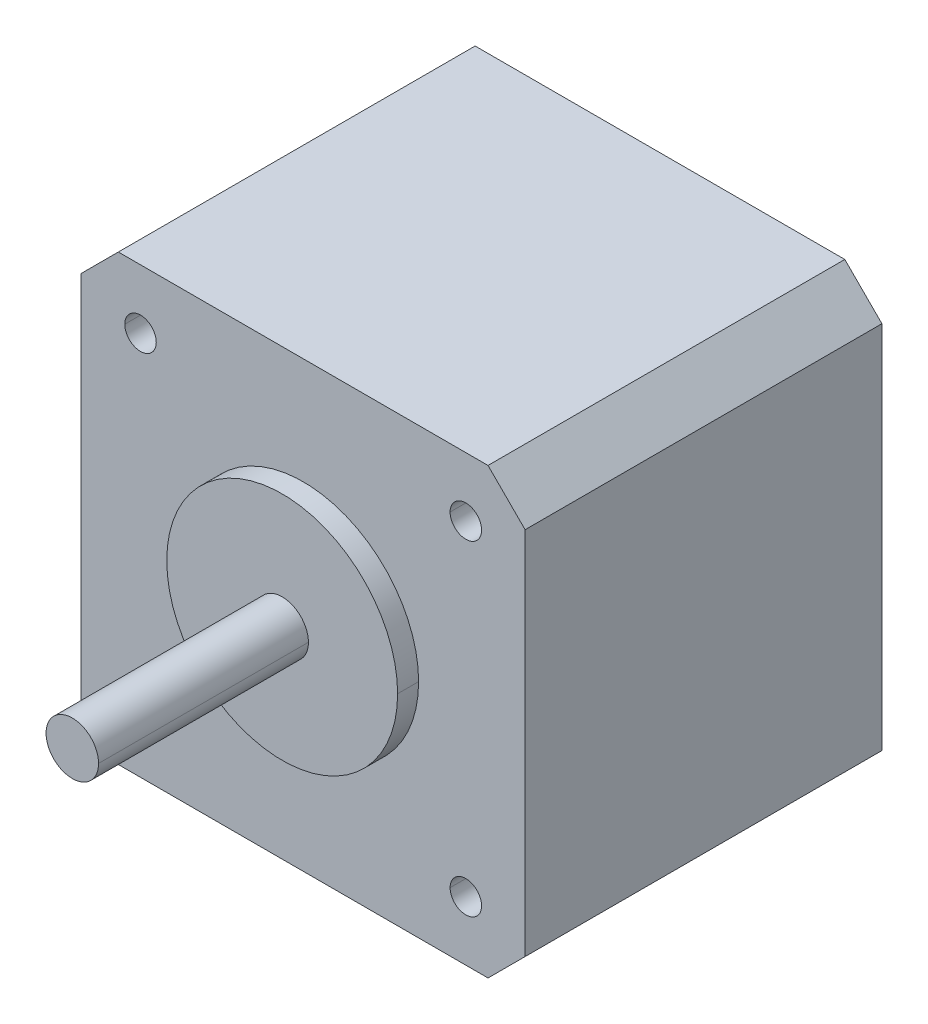
ISO-10303-21;
HEADER;
FILE_DESCRIPTION(('STEP AP214'),'2;1');
FILE_NAME('part.step','',(''),(''),'','','');
FILE_SCHEMA(('AUTOMOTIVE_DESIGN { 1 0 10303 214 1 1 1 1 }'));
ENDSEC;
DATA;
#1=APPLICATION_CONTEXT('core data for automotive mechanical design processes');
#2=APPLICATION_PROTOCOL_DEFINITION('international standard','automotive_design',2000,#1);
#3=PRODUCT_CONTEXT('',#1,'mechanical');
#4=PRODUCT('Part','Part','',(#3));
#5=PRODUCT_RELATED_PRODUCT_CATEGORY('part','',(#4));
#6=PRODUCT_DEFINITION_FORMATION('','',#4);
#7=PRODUCT_DEFINITION_CONTEXT('part definition',#1,'design');
#8=PRODUCT_DEFINITION('design','',#6,#7);
#9=PRODUCT_DEFINITION_SHAPE('','',#8);
#10=(LENGTH_UNIT() NAMED_UNIT(*) SI_UNIT(.MILLI.,.METRE.));
#11=(NAMED_UNIT(*) PLANE_ANGLE_UNIT() SI_UNIT($,.RADIAN.));
#12=(NAMED_UNIT(*) SI_UNIT($,.STERADIAN.) SOLID_ANGLE_UNIT());
#13=UNCERTAINTY_MEASURE_WITH_UNIT(LENGTH_MEASURE(1.E-05),#10,'distance_accuracy_value','');
#14=(GEOMETRIC_REPRESENTATION_CONTEXT(3) GLOBAL_UNCERTAINTY_ASSIGNED_CONTEXT((#13)) GLOBAL_UNIT_ASSIGNED_CONTEXT((#10,
#11,#12)) REPRESENTATION_CONTEXT('',''));
#15=CARTESIAN_POINT('',(0.,0.,0.));
#16=DIRECTION('',(0.,0.,1.));
#17=DIRECTION('',(1.,0.,0.));
#18=AXIS2_PLACEMENT_3D('',#15,#16,#17);
#19=CARTESIAN_POINT('',(0.,0.,46.));
#20=DIRECTION('',(0.,0.,1.));
#21=DIRECTION('',(1.,0.,0.));
#22=AXIS2_PLACEMENT_3D('',#19,#20,#21);
#23=CYLINDRICAL_SURFACE('',#22,2.5);
#24=DIRECTION('',(0.,0.,1.));
#25=VECTOR('',#24,1.);
#26=CARTESIAN_POINT('',(2.5,0.,46.));
#27=LINE('',#26,#25);
#28=CARTESIAN_POINT('',(2.5,0.,36.));
#29=VERTEX_POINT('',#28);
#30=CARTESIAN_POINT('',(2.5,0.,56.));
#31=VERTEX_POINT('',#30);
#32=EDGE_CURVE('E39',#29,#31,#27,.T.);
#33=ORIENTED_EDGE('',*,*,#32,.F.);
#34=CARTESIAN_POINT('',(0.,0.,36.));
#35=DIRECTION('',(0.,0.,1.));
#36=DIRECTION('',(1.,0.,0.));
#37=AXIS2_PLACEMENT_3D('',#34,#35,#36);
#38=CIRCLE('',#37,2.5);
#39=CARTESIAN_POINT('',(-2.5,0.,36.));
#40=VERTEX_POINT('',#39);
#41=EDGE_CURVE('E10',#29,#40,#38,.T.);
#42=ORIENTED_EDGE('',*,*,#41,.T.);
#43=DIRECTION('',(0.,0.,1.));
#44=VECTOR('',#43,1.);
#45=CARTESIAN_POINT('',(-2.5,0.,46.));
#46=LINE('',#45,#44);
#47=CARTESIAN_POINT('',(-2.5,0.,56.));
#48=VERTEX_POINT('',#47);
#49=EDGE_CURVE('E26',#40,#48,#46,.T.);
#50=ORIENTED_EDGE('',*,*,#49,.T.);
#51=CARTESIAN_POINT('',(0.,0.,56.));
#52=DIRECTION('',(0.,0.,1.));
#53=DIRECTION('',(1.,0.,0.));
#54=AXIS2_PLACEMENT_3D('',#51,#52,#53);
#55=CIRCLE('',#54,2.5);
#56=EDGE_CURVE('E302',#31,#48,#55,.T.);
#57=ORIENTED_EDGE('',*,*,#56,.F.);
#58=EDGE_LOOP('',(#33,#42,#50,#57));
#59=FACE_BOUND('',#58,.T.);
#60=ADVANCED_FACE('F15',(#59),#23,.T.);
#61=CARTESIAN_POINT('',(0.,0.,46.));
#62=DIRECTION('',(0.,0.,1.));
#63=DIRECTION('',(1.,0.,0.));
#64=AXIS2_PLACEMENT_3D('',#61,#62,#63);
#65=CYLINDRICAL_SURFACE('',#64,2.5);
#66=ORIENTED_EDGE('',*,*,#49,.F.);
#67=CARTESIAN_POINT('',(0.,0.,36.));
#68=DIRECTION('',(0.,0.,1.));
#69=DIRECTION('',(1.,0.,0.));
#70=AXIS2_PLACEMENT_3D('',#67,#68,#69);
#71=CIRCLE('',#70,2.5);
#72=EDGE_CURVE('E313',#40,#29,#71,.T.);
#73=ORIENTED_EDGE('',*,*,#72,.T.);
#74=ORIENTED_EDGE('',*,*,#32,.T.);
#75=CARTESIAN_POINT('',(0.,0.,56.));
#76=DIRECTION('',(0.,0.,1.));
#77=DIRECTION('',(1.,0.,0.));
#78=AXIS2_PLACEMENT_3D('',#75,#76,#77);
#79=CIRCLE('',#78,2.5);
#80=EDGE_CURVE('E300',#48,#31,#79,.T.);
#81=ORIENTED_EDGE('',*,*,#80,.F.);
#82=EDGE_LOOP('',(#66,#73,#74,#81));
#83=FACE_BOUND('',#82,.T.);
#84=ADVANCED_FACE('F472',(#83),#65,.T.);
#85=CARTESIAN_POINT('',(0.,0.,56.));
#86=DIRECTION('',(0.,0.,1.));
#87=DIRECTION('',(1.,0.,0.));
#88=AXIS2_PLACEMENT_3D('',#85,#86,#87);
#89=PLANE('',#88);
#90=ORIENTED_EDGE('',*,*,#56,.T.);
#91=ORIENTED_EDGE('',*,*,#80,.T.);
#92=EDGE_LOOP('',(#90,#91));
#93=FACE_BOUND('',#92,.T.);
#94=ADVANCED_FACE('F477',(#93),#89,.T.);
#95=CARTESIAN_POINT('',(0.,0.,36.));
#96=DIRECTION('',(0.,0.,1.));
#97=DIRECTION('',(1.,0.,0.));
#98=AXIS2_PLACEMENT_3D('',#95,#96,#97);
#99=PLANE('',#98);
#100=CARTESIAN_POINT('',(0.,0.,36.));
#101=DIRECTION('',(0.,0.,1.));
#102=DIRECTION('',(1.,0.,0.));
#103=AXIS2_PLACEMENT_3D('',#100,#101,#102);
#104=CIRCLE('',#103,11.);
#105=CARTESIAN_POINT('',(11.,0.,36.));
#106=VERTEX_POINT('',#105);
#107=CARTESIAN_POINT('',(-11.,0.,36.));
#108=VERTEX_POINT('',#107);
#109=EDGE_CURVE('E263',#106,#108,#104,.T.);
#110=ORIENTED_EDGE('',*,*,#109,.T.);
#111=CARTESIAN_POINT('',(0.,0.,36.));
#112=DIRECTION('',(0.,0.,1.));
#113=DIRECTION('',(1.,0.,0.));
#114=AXIS2_PLACEMENT_3D('',#111,#112,#113);
#115=CIRCLE('',#114,11.);
#116=EDGE_CURVE('E260',#108,#106,#115,.T.);
#117=ORIENTED_EDGE('',*,*,#116,.T.);
#118=EDGE_LOOP('',(#110,#117));
#119=FACE_BOUND('',#118,.T.);
#120=ORIENTED_EDGE('',*,*,#41,.F.);
#121=ORIENTED_EDGE('',*,*,#72,.F.);
#122=EDGE_LOOP('',(#120,#121));
#123=FACE_BOUND('',#122,.T.);
#124=ADVANCED_FACE('F483',(#119,#123),#99,.T.);
#125=CARTESIAN_POINT('',(-21.15,-17.6144660941,0.));
#126=DIRECTION('',(1.,0.,0.));
#127=DIRECTION('',(0.,1.,0.));
#128=AXIS2_PLACEMENT_3D('',#125,#126,#127);
#129=PLANE('',#128);
#130=DIRECTION('',(0.,0.,1.));
#131=VECTOR('',#130,1.);
#132=CARTESIAN_POINT('',(-21.15,17.6144660941,17.));
#133=LINE('',#132,#131);
#134=CARTESIAN_POINT('',(-21.15,17.6144660941,0.));
#135=VERTEX_POINT('',#134);
#136=CARTESIAN_POINT('',(-21.15,17.6144660941,34.));
#137=VERTEX_POINT('',#136);
#138=EDGE_CURVE('E249',#135,#137,#133,.T.);
#139=ORIENTED_EDGE('',*,*,#138,.F.);
#140=DIRECTION('',(0.,-1.,0.));
#141=VECTOR('',#140,1.);
#142=CARTESIAN_POINT('',(-21.15,0.,0.));
#143=LINE('',#142,#141);
#144=CARTESIAN_POINT('',(-21.15,-17.6144660941,0.));
#145=VERTEX_POINT('',#144);
#146=EDGE_CURVE('E218',#135,#145,#143,.T.);
#147=ORIENTED_EDGE('',*,*,#146,.T.);
#148=DIRECTION('',(0.,0.,1.));
#149=VECTOR('',#148,1.);
#150=CARTESIAN_POINT('',(-21.15,-17.6144660941,17.));
#151=LINE('',#150,#149);
#152=CARTESIAN_POINT('',(-21.15,-17.6144660941,34.));
#153=VERTEX_POINT('',#152);
#154=EDGE_CURVE('E216',#145,#153,#151,.T.);
#155=ORIENTED_EDGE('',*,*,#154,.T.);
#156=DIRECTION('',(0.,-1.,0.));
#157=VECTOR('',#156,1.);
#158=CARTESIAN_POINT('',(-21.15,0.,34.));
#159=LINE('',#158,#157);
#160=EDGE_CURVE('E201',#137,#153,#159,.T.);
#161=ORIENTED_EDGE('',*,*,#160,.F.);
#162=EDGE_LOOP('',(#139,#147,#155,#161));
#163=FACE_BOUND('',#162,.T.);
#164=ADVANCED_FACE('F17',(#163),#129,.F.);
#165=CARTESIAN_POINT('',(-17.6144660941,-21.15,0.));
#166=DIRECTION('',(0.707106781186548,0.707106781186548,0.));
#167=DIRECTION('',(0.,0.,-1.));
#168=AXIS2_PLACEMENT_3D('',#165,#166,#167);
#169=PLANE('',#168);
#170=ORIENTED_EDGE('',*,*,#154,.F.);
#171=DIRECTION('',(0.707106781186548,-0.707106781186548,0.));
#172=VECTOR('',#171,1.);
#173=CARTESIAN_POINT('',(-19.382233047,-19.382233047,0.));
#174=LINE('',#173,#172);
#175=CARTESIAN_POINT('',(-17.6144660941,-21.15,0.));
#176=VERTEX_POINT('',#175);
#177=EDGE_CURVE('E223',#145,#176,#174,.T.);
#178=ORIENTED_EDGE('',*,*,#177,.T.);
#179=DIRECTION('',(0.,0.,1.));
#180=VECTOR('',#179,1.);
#181=CARTESIAN_POINT('',(-17.6144660941,-21.15,17.));
#182=LINE('',#181,#180);
#183=CARTESIAN_POINT('',(-17.6144660941,-21.15,34.));
#184=VERTEX_POINT('',#183);
#185=EDGE_CURVE('E226',#176,#184,#182,.T.);
#186=ORIENTED_EDGE('',*,*,#185,.T.);
#187=DIRECTION('',(0.707106781186548,-0.707106781186548,0.));
#188=VECTOR('',#187,1.);
#189=CARTESIAN_POINT('',(-19.382233047,-19.382233047,34.));
#190=LINE('',#189,#188);
#191=EDGE_CURVE('E206',#153,#184,#190,.T.);
#192=ORIENTED_EDGE('',*,*,#191,.F.);
#193=EDGE_LOOP('',(#170,#178,#186,#192));
#194=FACE_BOUND('',#193,.T.);
#195=ADVANCED_FACE('F225',(#194),#169,.F.);
#196=CARTESIAN_POINT('',(17.6144660941,-21.15,0.));
#197=DIRECTION('',(0.,1.,0.));
#198=DIRECTION('',(1.,0.,0.));
#199=AXIS2_PLACEMENT_3D('',#196,#197,#198);
#200=PLANE('',#199);
#201=ORIENTED_EDGE('',*,*,#185,.F.);
#202=DIRECTION('',(1.,0.,0.));
#203=VECTOR('',#202,1.);
#204=CARTESIAN_POINT('',(0.,-21.15,0.));
#205=LINE('',#204,#203);
#206=CARTESIAN_POINT('',(17.6144660941,-21.15,0.));
#207=VERTEX_POINT('',#206);
#208=EDGE_CURVE('E361',#176,#207,#205,.T.);
#209=ORIENTED_EDGE('',*,*,#208,.T.);
#210=DIRECTION('',(0.,0.,1.));
#211=VECTOR('',#210,1.);
#212=CARTESIAN_POINT('',(17.6144660941,-21.15,17.));
#213=LINE('',#212,#211);
#214=CARTESIAN_POINT('',(17.6144660941,-21.15,34.));
#215=VERTEX_POINT('',#214);
#216=EDGE_CURVE('E19',#207,#215,#213,.T.);
#217=ORIENTED_EDGE('',*,*,#216,.T.);
#218=DIRECTION('',(1.,0.,0.));
#219=VECTOR('',#218,1.);
#220=CARTESIAN_POINT('',(0.,-21.15,34.));
#221=LINE('',#220,#219);
#222=EDGE_CURVE('E229',#184,#215,#221,.T.);
#223=ORIENTED_EDGE('',*,*,#222,.F.);
#224=EDGE_LOOP('',(#201,#209,#217,#223));
#225=FACE_BOUND('',#224,.T.);
#226=ADVANCED_FACE('F502',(#225),#200,.F.);
#227=CARTESIAN_POINT('',(21.15,-17.6144660941,0.));
#228=DIRECTION('',(-0.707106781186548,0.707106781186548,0.));
#229=DIRECTION('',(0.,0.,1.));
#230=AXIS2_PLACEMENT_3D('',#227,#228,#229);
#231=PLANE('',#230);
#232=ORIENTED_EDGE('',*,*,#216,.F.);
#233=DIRECTION('',(0.707106781186548,0.707106781186548,0.));
#234=VECTOR('',#233,1.);
#235=CARTESIAN_POINT('',(19.382233047,-19.382233047,0.));
#236=LINE('',#235,#234);
#237=CARTESIAN_POINT('',(21.15,-17.6144660941,0.));
#238=VERTEX_POINT('',#237);
#239=EDGE_CURVE('E349',#207,#238,#236,.T.);
#240=ORIENTED_EDGE('',*,*,#239,.T.);
#241=DIRECTION('',(0.,0.,1.));
#242=VECTOR('',#241,1.);
#243=CARTESIAN_POINT('',(21.15,-17.6144660941,17.));
#244=LINE('',#243,#242);
#245=CARTESIAN_POINT('',(21.15,-17.6144660941,34.));
#246=VERTEX_POINT('',#245);
#247=EDGE_CURVE('E321',#238,#246,#244,.T.);
#248=ORIENTED_EDGE('',*,*,#247,.T.);
#249=DIRECTION('',(0.707106781186548,0.707106781186548,0.));
#250=VECTOR('',#249,1.);
#251=CARTESIAN_POINT('',(19.382233047,-19.382233047,34.));
#252=LINE('',#251,#250);
#253=EDGE_CURVE('E235',#215,#246,#252,.T.);
#254=ORIENTED_EDGE('',*,*,#253,.F.);
#255=EDGE_LOOP('',(#232,#240,#248,#254));
#256=FACE_BOUND('',#255,.T.);
#257=ADVANCED_FACE('F498',(#256),#231,.F.);
#258=CARTESIAN_POINT('',(21.15,17.6144660941,0.));
#259=DIRECTION('',(-1.,0.,0.));
#260=DIRECTION('',(0.,0.,1.));
#261=AXIS2_PLACEMENT_3D('',#258,#259,#260);
#262=PLANE('',#261);
#263=ORIENTED_EDGE('',*,*,#247,.F.);
#264=DIRECTION('',(0.,1.,0.));
#265=VECTOR('',#264,1.);
#266=CARTESIAN_POINT('',(21.15,0.,0.));
#267=LINE('',#266,#265);
#268=CARTESIAN_POINT('',(21.15,17.6144660941,0.));
#269=VERTEX_POINT('',#268);
#270=EDGE_CURVE('E317',#238,#269,#267,.T.);
#271=ORIENTED_EDGE('',*,*,#270,.T.);
#272=DIRECTION('',(0.,0.,1.));
#273=VECTOR('',#272,1.);
#274=CARTESIAN_POINT('',(21.15,17.6144660941,17.));
#275=LINE('',#274,#273);
#276=CARTESIAN_POINT('',(21.15,17.6144660941,34.));
#277=VERTEX_POINT('',#276);
#278=EDGE_CURVE('E322',#269,#277,#275,.T.);
#279=ORIENTED_EDGE('',*,*,#278,.T.);
#280=DIRECTION('',(0.,1.,0.));
#281=VECTOR('',#280,1.);
#282=CARTESIAN_POINT('',(21.15,0.,34.));
#283=LINE('',#282,#281);
#284=EDGE_CURVE('E342',#246,#277,#283,.T.);
#285=ORIENTED_EDGE('',*,*,#284,.F.);
#286=EDGE_LOOP('',(#263,#271,#279,#285));
#287=FACE_BOUND('',#286,.T.);
#288=ADVANCED_FACE('F501',(#287),#262,.F.);
#289=CARTESIAN_POINT('',(17.6144660941,21.15,0.));
#290=DIRECTION('',(-0.707106781186548,-0.707106781186548,0.));
#291=DIRECTION('',(-0.707106781186548,0.707106781186548,0.));
#292=AXIS2_PLACEMENT_3D('',#289,#290,#291);
#293=PLANE('',#292);
#294=ORIENTED_EDGE('',*,*,#278,.F.);
#295=DIRECTION('',(-0.707106781186548,0.707106781186548,0.));
#296=VECTOR('',#295,1.);
#297=CARTESIAN_POINT('',(19.382233047,19.382233047,0.));
#298=LINE('',#297,#296);
#299=CARTESIAN_POINT('',(17.6144660941,21.15,0.));
#300=VERTEX_POINT('',#299);
#301=EDGE_CURVE('E341',#269,#300,#298,.T.);
#302=ORIENTED_EDGE('',*,*,#301,.T.);
#303=DIRECTION('',(0.,0.,1.));
#304=VECTOR('',#303,1.);
#305=CARTESIAN_POINT('',(17.6144660941,21.15,17.));
#306=LINE('',#305,#304);
#307=CARTESIAN_POINT('',(17.6144660941,21.15,34.));
#308=VERTEX_POINT('',#307);
#309=EDGE_CURVE('E369',#300,#308,#306,.T.);
#310=ORIENTED_EDGE('',*,*,#309,.T.);
#311=DIRECTION('',(-0.707106781186548,0.707106781186548,0.));
#312=VECTOR('',#311,1.);
#313=CARTESIAN_POINT('',(19.382233047,19.382233047,34.));
#314=LINE('',#313,#312);
#315=EDGE_CURVE('E345',#277,#308,#314,.T.);
#316=ORIENTED_EDGE('',*,*,#315,.F.);
#317=EDGE_LOOP('',(#294,#302,#310,#316));
#318=FACE_BOUND('',#317,.T.);
#319=ADVANCED_FACE('F512',(#318),#293,.F.);
#320=CARTESIAN_POINT('',(-17.6144660941,21.15,0.));
#321=DIRECTION('',(0.,-1.,0.));
#322=DIRECTION('',(0.,0.,-1.));
#323=AXIS2_PLACEMENT_3D('',#320,#321,#322);
#324=PLANE('',#323);
#325=ORIENTED_EDGE('',*,*,#309,.F.);
#326=DIRECTION('',(-1.,0.,0.));
#327=VECTOR('',#326,1.);
#328=CARTESIAN_POINT('',(0.,21.15,0.));
#329=LINE('',#328,#327);
#330=CARTESIAN_POINT('',(-17.6144660941,21.15,0.));
#331=VERTEX_POINT('',#330);
#332=EDGE_CURVE('E253',#300,#331,#329,.T.);
#333=ORIENTED_EDGE('',*,*,#332,.T.);
#334=DIRECTION('',(0.,0.,1.));
#335=VECTOR('',#334,1.);
#336=CARTESIAN_POINT('',(-17.6144660941,21.15,17.));
#337=LINE('',#336,#335);
#338=CARTESIAN_POINT('',(-17.6144660941,21.15,34.));
#339=VERTEX_POINT('',#338);
#340=EDGE_CURVE('E248',#331,#339,#337,.T.);
#341=ORIENTED_EDGE('',*,*,#340,.T.);
#342=DIRECTION('',(-1.,0.,0.));
#343=VECTOR('',#342,1.);
#344=CARTESIAN_POINT('',(0.,21.15,34.));
#345=LINE('',#344,#343);
#346=EDGE_CURVE('E325',#308,#339,#345,.T.);
#347=ORIENTED_EDGE('',*,*,#346,.F.);
#348=EDGE_LOOP('',(#325,#333,#341,#347));
#349=FACE_BOUND('',#348,.T.);
#350=ADVANCED_FACE('F510',(#349),#324,.F.);
#351=CARTESIAN_POINT('',(-21.15,17.6144660941,0.));
#352=DIRECTION('',(0.707106781186548,-0.707106781186548,0.));
#353=DIRECTION('',(0.,0.,-1.));
#354=AXIS2_PLACEMENT_3D('',#351,#352,#353);
#355=PLANE('',#354);
#356=ORIENTED_EDGE('',*,*,#340,.F.);
#357=DIRECTION('',(-0.707106781186548,-0.707106781186548,0.));
#358=VECTOR('',#357,1.);
#359=CARTESIAN_POINT('',(-19.382233047,19.382233047,0.));
#360=LINE('',#359,#358);
#361=EDGE_CURVE('E244',#331,#135,#360,.T.);
#362=ORIENTED_EDGE('',*,*,#361,.T.);
#363=ORIENTED_EDGE('',*,*,#138,.T.);
#364=DIRECTION('',(-0.707106781186548,-0.707106781186548,0.));
#365=VECTOR('',#364,1.);
#366=CARTESIAN_POINT('',(-19.382233047,19.382233047,34.));
#367=LINE('',#366,#365);
#368=EDGE_CURVE('E209',#339,#137,#367,.T.);
#369=ORIENTED_EDGE('',*,*,#368,.F.);
#370=EDGE_LOOP('',(#356,#362,#363,#369));
#371=FACE_BOUND('',#370,.T.);
#372=ADVANCED_FACE('F506',(#371),#355,.F.);
#373=CARTESIAN_POINT('',(0.,0.,0.));
#374=DIRECTION('',(0.,0.,1.));
#375=DIRECTION('',(1.,0.,0.));
#376=AXIS2_PLACEMENT_3D('',#373,#374,#375);
#377=PLANE('',#376);
#378=ORIENTED_EDGE('',*,*,#361,.F.);
#379=ORIENTED_EDGE('',*,*,#332,.F.);
#380=ORIENTED_EDGE('',*,*,#301,.F.);
#381=ORIENTED_EDGE('',*,*,#270,.F.);
#382=ORIENTED_EDGE('',*,*,#239,.F.);
#383=ORIENTED_EDGE('',*,*,#208,.F.);
#384=ORIENTED_EDGE('',*,*,#177,.F.);
#385=ORIENTED_EDGE('',*,*,#146,.F.);
#386=EDGE_LOOP('',(#378,#379,#380,#381,#382,#383,#384,#385));
#387=FACE_BOUND('',#386,.T.);
#388=ADVANCED_FACE('F509',(#387),#377,.F.);
#389=CARTESIAN_POINT('',(0.,0.,35.));
#390=DIRECTION('',(0.,0.,1.));
#391=DIRECTION('',(1.,0.,0.));
#392=AXIS2_PLACEMENT_3D('',#389,#390,#391);
#393=CYLINDRICAL_SURFACE('',#392,11.);
#394=DIRECTION('',(0.,0.,1.));
#395=VECTOR('',#394,1.);
#396=CARTESIAN_POINT('',(-11.,0.,35.));
#397=LINE('',#396,#395);
#398=CARTESIAN_POINT('',(-11.,0.,34.));
#399=VERTEX_POINT('',#398);
#400=EDGE_CURVE('E213',#399,#108,#397,.T.);
#401=ORIENTED_EDGE('',*,*,#400,.F.);
#402=CARTESIAN_POINT('',(0.,0.,34.));
#403=DIRECTION('',(0.,0.,1.));
#404=DIRECTION('',(1.,0.,0.));
#405=AXIS2_PLACEMENT_3D('',#402,#403,#404);
#406=CIRCLE('',#405,11.);
#407=CARTESIAN_POINT('',(11.,0.,34.));
#408=VERTEX_POINT('',#407);
#409=EDGE_CURVE('E352',#399,#408,#406,.T.);
#410=ORIENTED_EDGE('',*,*,#409,.T.);
#411=DIRECTION('',(0.,0.,1.));
#412=VECTOR('',#411,1.);
#413=CARTESIAN_POINT('',(11.,0.,35.));
#414=LINE('',#413,#412);
#415=EDGE_CURVE('E330',#408,#106,#414,.T.);
#416=ORIENTED_EDGE('',*,*,#415,.T.);
#417=ORIENTED_EDGE('',*,*,#116,.F.);
#418=EDGE_LOOP('',(#401,#410,#416,#417));
#419=FACE_BOUND('',#418,.T.);
#420=ADVANCED_FACE('F436',(#419),#393,.T.);
#421=CARTESIAN_POINT('',(0.,0.,35.));
#422=DIRECTION('',(0.,0.,1.));
#423=DIRECTION('',(1.,0.,0.));
#424=AXIS2_PLACEMENT_3D('',#421,#422,#423);
#425=CYLINDRICAL_SURFACE('',#424,11.);
#426=ORIENTED_EDGE('',*,*,#415,.F.);
#427=CARTESIAN_POINT('',(0.,0.,34.));
#428=DIRECTION('',(0.,0.,1.));
#429=DIRECTION('',(1.,0.,0.));
#430=AXIS2_PLACEMENT_3D('',#427,#428,#429);
#431=CIRCLE('',#430,11.);
#432=EDGE_CURVE('E326',#408,#399,#431,.T.);
#433=ORIENTED_EDGE('',*,*,#432,.T.);
#434=ORIENTED_EDGE('',*,*,#400,.T.);
#435=ORIENTED_EDGE('',*,*,#109,.F.);
#436=EDGE_LOOP('',(#426,#433,#434,#435));
#437=FACE_BOUND('',#436,.T.);
#438=ADVANCED_FACE('F431',(#437),#425,.T.);
#439=CARTESIAN_POINT('',(0.,0.,34.));
#440=DIRECTION('',(0.,0.,1.));
#441=DIRECTION('',(1.,0.,0.));
#442=AXIS2_PLACEMENT_3D('',#439,#440,#441);
#443=PLANE('',#442);
#444=ORIENTED_EDGE('',*,*,#160,.T.);
#445=ORIENTED_EDGE('',*,*,#191,.T.);
#446=ORIENTED_EDGE('',*,*,#222,.T.);
#447=ORIENTED_EDGE('',*,*,#253,.T.);
#448=ORIENTED_EDGE('',*,*,#284,.T.);
#449=ORIENTED_EDGE('',*,*,#315,.T.);
#450=ORIENTED_EDGE('',*,*,#346,.T.);
#451=ORIENTED_EDGE('',*,*,#368,.T.);
#452=EDGE_LOOP('',(#444,#445,#446,#447,#448,#449,#450,#451));
#453=FACE_BOUND('',#452,.T.);
#454=ORIENTED_EDGE('',*,*,#432,.F.);
#455=ORIENTED_EDGE('',*,*,#409,.F.);
#456=EDGE_LOOP('',(#454,#455));
#457=FACE_BOUND('',#456,.T.);
#458=CARTESIAN_POINT('',(-15.5,15.5,34.));
#459=DIRECTION('',(0.,0.,1.));
#460=DIRECTION('',(1.,0.,0.));
#461=AXIS2_PLACEMENT_3D('',#458,#459,#460);
#462=CIRCLE('',#461,1.5);
#463=CARTESIAN_POINT('',(-14.,15.5,34.));
#464=VERTEX_POINT('',#463);
#465=CARTESIAN_POINT('',(-17.,15.5,34.));
#466=VERTEX_POINT('',#465);
#467=EDGE_CURVE('E396',#464,#466,#462,.T.);
#468=ORIENTED_EDGE('',*,*,#467,.F.);
#469=CARTESIAN_POINT('',(-15.5,15.5,34.));
#470=DIRECTION('',(0.,0.,1.));
#471=DIRECTION('',(1.,0.,0.));
#472=AXIS2_PLACEMENT_3D('',#469,#470,#471);
#473=CIRCLE('',#472,1.5);
#474=EDGE_CURVE('E276',#466,#464,#473,.T.);
#475=ORIENTED_EDGE('',*,*,#474,.F.);
#476=EDGE_LOOP('',(#468,#475));
#477=FACE_BOUND('',#476,.T.);
#478=CARTESIAN_POINT('',(15.5,15.5,34.));
#479=DIRECTION('',(0.,0.,1.));
#480=DIRECTION('',(1.,0.,0.));
#481=AXIS2_PLACEMENT_3D('',#478,#479,#480);
#482=CIRCLE('',#481,1.5);
#483=CARTESIAN_POINT('',(14.,15.5,34.));
#484=VERTEX_POINT('',#483);
#485=CARTESIAN_POINT('',(17.,15.5,34.));
#486=VERTEX_POINT('',#485);
#487=EDGE_CURVE('E242',#484,#486,#482,.T.);
#488=ORIENTED_EDGE('',*,*,#487,.F.);
#489=CARTESIAN_POINT('',(15.5,15.5,34.));
#490=DIRECTION('',(0.,0.,1.));
#491=DIRECTION('',(1.,0.,0.));
#492=AXIS2_PLACEMENT_3D('',#489,#490,#491);
#493=CIRCLE('',#492,1.5);
#494=EDGE_CURVE('E243',#486,#484,#493,.T.);
#495=ORIENTED_EDGE('',*,*,#494,.F.);
#496=EDGE_LOOP('',(#488,#495));
#497=FACE_BOUND('',#496,.T.);
#498=CARTESIAN_POINT('',(15.5,-15.5,34.));
#499=DIRECTION('',(0.,0.,1.));
#500=DIRECTION('',(1.,0.,0.));
#501=AXIS2_PLACEMENT_3D('',#498,#499,#500);
#502=CIRCLE('',#501,1.5);
#503=CARTESIAN_POINT('',(14.,-15.5,34.));
#504=VERTEX_POINT('',#503);
#505=CARTESIAN_POINT('',(17.,-15.5,34.));
#506=VERTEX_POINT('',#505);
#507=EDGE_CURVE('E269',#504,#506,#502,.T.);
#508=ORIENTED_EDGE('',*,*,#507,.F.);
#509=CARTESIAN_POINT('',(15.5,-15.5,34.));
#510=DIRECTION('',(0.,0.,1.));
#511=DIRECTION('',(1.,0.,0.));
#512=AXIS2_PLACEMENT_3D('',#509,#510,#511);
#513=CIRCLE('',#512,1.5);
#514=EDGE_CURVE('E334',#506,#504,#513,.T.);
#515=ORIENTED_EDGE('',*,*,#514,.F.);
#516=EDGE_LOOP('',(#508,#515));
#517=FACE_BOUND('',#516,.T.);
#518=CARTESIAN_POINT('',(-15.5,-15.5,34.));
#519=DIRECTION('',(0.,0.,1.));
#520=DIRECTION('',(1.,0.,0.));
#521=AXIS2_PLACEMENT_3D('',#518,#519,#520);
#522=CIRCLE('',#521,1.5);
#523=CARTESIAN_POINT('',(-14.,-15.5,34.));
#524=VERTEX_POINT('',#523);
#525=CARTESIAN_POINT('',(-17.,-15.5,34.));
#526=VERTEX_POINT('',#525);
#527=EDGE_CURVE('E239',#524,#526,#522,.T.);
#528=ORIENTED_EDGE('',*,*,#527,.F.);
#529=CARTESIAN_POINT('',(-15.5,-15.5,34.));
#530=DIRECTION('',(0.,0.,1.));
#531=DIRECTION('',(1.,0.,0.));
#532=AXIS2_PLACEMENT_3D('',#529,#530,#531);
#533=CIRCLE('',#532,1.5);
#534=EDGE_CURVE('E258',#526,#524,#533,.T.);
#535=ORIENTED_EDGE('',*,*,#534,.F.);
#536=EDGE_LOOP('',(#528,#535));
#537=FACE_BOUND('',#536,.T.);
#538=ADVANCED_FACE('F203',(#453,#457,#477,#497,#517,#537),#443,.T.);
#539=CARTESIAN_POINT('',(15.5,-15.5,32.));
#540=DIRECTION('',(0.,0.,1.));
#541=DIRECTION('',(-1.,0.,0.));
#542=AXIS2_PLACEMENT_3D('',#539,#540,#541);
#543=CYLINDRICAL_SURFACE('',#542,1.5);
#544=DIRECTION('',(0.,0.,-1.));
#545=VECTOR('',#544,1.);
#546=CARTESIAN_POINT('',(14.,-15.5,32.));
#547=LINE('',#546,#545);
#548=CARTESIAN_POINT('',(14.,-15.5,30.));
#549=VERTEX_POINT('',#548);
#550=EDGE_CURVE('E311',#504,#549,#547,.T.);
#551=ORIENTED_EDGE('',*,*,#550,.F.);
#552=ORIENTED_EDGE('',*,*,#507,.T.);
#553=DIRECTION('',(0.,0.,-1.));
#554=VECTOR('',#553,1.);
#555=CARTESIAN_POINT('',(17.,-15.5,32.));
#556=LINE('',#555,#554);
#557=CARTESIAN_POINT('',(17.,-15.5,30.));
#558=VERTEX_POINT('',#557);
#559=EDGE_CURVE('E272',#506,#558,#556,.T.);
#560=ORIENTED_EDGE('',*,*,#559,.T.);
#561=CARTESIAN_POINT('',(15.5,-15.5,30.));
#562=DIRECTION('',(0.,0.,1.));
#563=DIRECTION('',(1.,0.,0.));
#564=AXIS2_PLACEMENT_3D('',#561,#562,#563);
#565=CIRCLE('',#564,1.5);
#566=EDGE_CURVE('E308',#549,#558,#565,.T.);
#567=ORIENTED_EDGE('',*,*,#566,.F.);
#568=EDGE_LOOP('',(#551,#552,#560,#567));
#569=FACE_BOUND('',#568,.T.);
#570=ADVANCED_FACE('F439',(#569),#543,.F.);
#571=CARTESIAN_POINT('',(15.5,-15.5,32.));
#572=DIRECTION('',(0.,0.,1.));
#573=DIRECTION('',(-1.,0.,0.));
#574=AXIS2_PLACEMENT_3D('',#571,#572,#573);
#575=CYLINDRICAL_SURFACE('',#574,1.5);
#576=ORIENTED_EDGE('',*,*,#559,.F.);
#577=ORIENTED_EDGE('',*,*,#514,.T.);
#578=ORIENTED_EDGE('',*,*,#550,.T.);
#579=CARTESIAN_POINT('',(15.5,-15.5,30.));
#580=DIRECTION('',(0.,0.,1.));
#581=DIRECTION('',(1.,0.,0.));
#582=AXIS2_PLACEMENT_3D('',#579,#580,#581);
#583=CIRCLE('',#582,1.5);
#584=EDGE_CURVE('E312',#558,#549,#583,.T.);
#585=ORIENTED_EDGE('',*,*,#584,.F.);
#586=EDGE_LOOP('',(#576,#577,#578,#585));
#587=FACE_BOUND('',#586,.T.);
#588=ADVANCED_FACE('F486',(#587),#575,.F.);
#589=CARTESIAN_POINT('',(0.,0.,30.));
#590=DIRECTION('',(0.,0.,1.));
#591=DIRECTION('',(1.,0.,0.));
#592=AXIS2_PLACEMENT_3D('',#589,#590,#591);
#593=PLANE('',#592);
#594=ORIENTED_EDGE('',*,*,#566,.T.);
#595=ORIENTED_EDGE('',*,*,#584,.T.);
#596=EDGE_LOOP('',(#594,#595));
#597=FACE_BOUND('',#596,.T.);
#598=ADVANCED_FACE('F518',(#597),#593,.T.);
#599=CARTESIAN_POINT('',(15.5,15.5,32.));
#600=DIRECTION('',(0.,0.,1.));
#601=DIRECTION('',(-1.,0.,0.));
#602=AXIS2_PLACEMENT_3D('',#599,#600,#601);
#603=CYLINDRICAL_SURFACE('',#602,1.5);
#604=DIRECTION('',(0.,0.,-1.));
#605=VECTOR('',#604,1.);
#606=CARTESIAN_POINT('',(14.,15.5,32.));
#607=LINE('',#606,#605);
#608=CARTESIAN_POINT('',(14.,15.5,30.));
#609=VERTEX_POINT('',#608);
#610=EDGE_CURVE('E353',#484,#609,#607,.T.);
#611=ORIENTED_EDGE('',*,*,#610,.F.);
#612=ORIENTED_EDGE('',*,*,#487,.T.);
#613=DIRECTION('',(0.,0.,-1.));
#614=VECTOR('',#613,1.);
#615=CARTESIAN_POINT('',(17.,15.5,32.));
#616=LINE('',#615,#614);
#617=CARTESIAN_POINT('',(17.,15.5,30.));
#618=VERTEX_POINT('',#617);
#619=EDGE_CURVE('E240',#486,#618,#616,.T.);
#620=ORIENTED_EDGE('',*,*,#619,.T.);
#621=CARTESIAN_POINT('',(15.5,15.5,30.));
#622=DIRECTION('',(0.,0.,1.));
#623=DIRECTION('',(1.,0.,0.));
#624=AXIS2_PLACEMENT_3D('',#621,#622,#623);
#625=CIRCLE('',#624,1.5);
#626=EDGE_CURVE('E184',#609,#618,#625,.T.);
#627=ORIENTED_EDGE('',*,*,#626,.F.);
#628=EDGE_LOOP('',(#611,#612,#620,#627));
#629=FACE_BOUND('',#628,.T.);
#630=ADVANCED_FACE('F493',(#629),#603,.F.);
#631=CARTESIAN_POINT('',(15.5,15.5,32.));
#632=DIRECTION('',(0.,0.,1.));
#633=DIRECTION('',(-1.,0.,0.));
#634=AXIS2_PLACEMENT_3D('',#631,#632,#633);
#635=CYLINDRICAL_SURFACE('',#634,1.5);
#636=ORIENTED_EDGE('',*,*,#619,.F.);
#637=ORIENTED_EDGE('',*,*,#494,.T.);
#638=ORIENTED_EDGE('',*,*,#610,.T.);
#639=CARTESIAN_POINT('',(15.5,15.5,30.));
#640=DIRECTION('',(0.,0.,1.));
#641=DIRECTION('',(1.,0.,0.));
#642=AXIS2_PLACEMENT_3D('',#639,#640,#641);
#643=CIRCLE('',#642,1.5);
#644=EDGE_CURVE('E266',#618,#609,#643,.T.);
#645=ORIENTED_EDGE('',*,*,#644,.F.);
#646=EDGE_LOOP('',(#636,#637,#638,#645));
#647=FACE_BOUND('',#646,.T.);
#648=ADVANCED_FACE('F489',(#647),#635,.F.);
#649=CARTESIAN_POINT('',(0.,0.,30.));
#650=DIRECTION('',(0.,0.,1.));
#651=DIRECTION('',(1.,0.,0.));
#652=AXIS2_PLACEMENT_3D('',#649,#650,#651);
#653=PLANE('',#652);
#654=ORIENTED_EDGE('',*,*,#626,.T.);
#655=ORIENTED_EDGE('',*,*,#644,.T.);
#656=EDGE_LOOP('',(#654,#655));
#657=FACE_BOUND('',#656,.T.);
#658=ADVANCED_FACE('F492',(#657),#653,.T.);
#659=CARTESIAN_POINT('',(-15.5,-15.5,32.));
#660=DIRECTION('',(0.,0.,1.));
#661=DIRECTION('',(1.,0.,0.));
#662=AXIS2_PLACEMENT_3D('',#659,#660,#661);
#663=CYLINDRICAL_SURFACE('',#662,1.5);
#664=DIRECTION('',(0.,0.,-1.));
#665=VECTOR('',#664,1.);
#666=CARTESIAN_POINT('',(-14.,-15.5,32.));
#667=LINE('',#666,#665);
#668=CARTESIAN_POINT('',(-14.,-15.5,30.));
#669=VERTEX_POINT('',#668);
#670=EDGE_CURVE('E254',#524,#669,#667,.T.);
#671=ORIENTED_EDGE('',*,*,#670,.F.);
#672=ORIENTED_EDGE('',*,*,#527,.T.);
#673=DIRECTION('',(0.,0.,-1.));
#674=VECTOR('',#673,1.);
#675=CARTESIAN_POINT('',(-17.,-15.5,32.));
#676=LINE('',#675,#674);
#677=CARTESIAN_POINT('',(-17.,-15.5,30.));
#678=VERTEX_POINT('',#677);
#679=EDGE_CURVE('E304',#526,#678,#676,.T.);
#680=ORIENTED_EDGE('',*,*,#679,.T.);
#681=CARTESIAN_POINT('',(-15.5,-15.5,30.));
#682=DIRECTION('',(0.,0.,1.));
#683=DIRECTION('',(1.,0.,0.));
#684=AXIS2_PLACEMENT_3D('',#681,#682,#683);
#685=CIRCLE('',#684,1.5);
#686=EDGE_CURVE('E259',#669,#678,#685,.T.);
#687=ORIENTED_EDGE('',*,*,#686,.F.);
#688=EDGE_LOOP('',(#671,#672,#680,#687));
#689=FACE_BOUND('',#688,.T.);
#690=ADVANCED_FACE('F453',(#689),#663,.F.);
#691=CARTESIAN_POINT('',(-15.5,-15.5,32.));
#692=DIRECTION('',(0.,0.,1.));
#693=DIRECTION('',(1.,0.,0.));
#694=AXIS2_PLACEMENT_3D('',#691,#692,#693);
#695=CYLINDRICAL_SURFACE('',#694,1.5);
#696=ORIENTED_EDGE('',*,*,#679,.F.);
#697=ORIENTED_EDGE('',*,*,#534,.T.);
#698=ORIENTED_EDGE('',*,*,#670,.T.);
#699=CARTESIAN_POINT('',(-15.5,-15.5,30.));
#700=DIRECTION('',(0.,0.,1.));
#701=DIRECTION('',(1.,0.,0.));
#702=AXIS2_PLACEMENT_3D('',#699,#700,#701);
#703=CIRCLE('',#702,1.5);
#704=EDGE_CURVE('E400',#678,#669,#703,.T.);
#705=ORIENTED_EDGE('',*,*,#704,.F.);
#706=EDGE_LOOP('',(#696,#697,#698,#705));
#707=FACE_BOUND('',#706,.T.);
#708=ADVANCED_FACE('F456',(#707),#695,.F.);
#709=CARTESIAN_POINT('',(0.,0.,30.));
#710=DIRECTION('',(0.,0.,1.));
#711=DIRECTION('',(1.,0.,0.));
#712=AXIS2_PLACEMENT_3D('',#709,#710,#711);
#713=PLANE('',#712);
#714=ORIENTED_EDGE('',*,*,#686,.T.);
#715=ORIENTED_EDGE('',*,*,#704,.T.);
#716=EDGE_LOOP('',(#714,#715));
#717=FACE_BOUND('',#716,.T.);
#718=ADVANCED_FACE('F458',(#717),#713,.T.);
#719=CARTESIAN_POINT('',(-15.5,15.5,32.));
#720=DIRECTION('',(0.,0.,1.));
#721=DIRECTION('',(1.,0.,0.));
#722=AXIS2_PLACEMENT_3D('',#719,#720,#721);
#723=CYLINDRICAL_SURFACE('',#722,1.5);
#724=DIRECTION('',(0.,0.,-1.));
#725=VECTOR('',#724,1.);
#726=CARTESIAN_POINT('',(-14.,15.5,32.));
#727=LINE('',#726,#725);
#728=CARTESIAN_POINT('',(-14.,15.5,30.));
#729=VERTEX_POINT('',#728);
#730=EDGE_CURVE('E273',#464,#729,#727,.T.);
#731=ORIENTED_EDGE('',*,*,#730,.F.);
#732=ORIENTED_EDGE('',*,*,#467,.T.);
#733=DIRECTION('',(0.,0.,-1.));
#734=VECTOR('',#733,1.);
#735=CARTESIAN_POINT('',(-17.,15.5,32.));
#736=LINE('',#735,#734);
#737=CARTESIAN_POINT('',(-17.,15.5,30.));
#738=VERTEX_POINT('',#737);
#739=EDGE_CURVE('E285',#466,#738,#736,.T.);
#740=ORIENTED_EDGE('',*,*,#739,.T.);
#741=CARTESIAN_POINT('',(-15.5,15.5,30.));
#742=DIRECTION('',(0.,0.,1.));
#743=DIRECTION('',(1.,0.,0.));
#744=AXIS2_PLACEMENT_3D('',#741,#742,#743);
#745=CIRCLE('',#744,1.5);
#746=EDGE_CURVE('E277',#729,#738,#745,.T.);
#747=ORIENTED_EDGE('',*,*,#746,.F.);
#748=EDGE_LOOP('',(#731,#732,#740,#747));
#749=FACE_BOUND('',#748,.T.);
#750=ADVANCED_FACE('F460',(#749),#723,.F.);
#751=CARTESIAN_POINT('',(-15.5,15.5,32.));
#752=DIRECTION('',(0.,0.,1.));
#753=DIRECTION('',(1.,0.,0.));
#754=AXIS2_PLACEMENT_3D('',#751,#752,#753);
#755=CYLINDRICAL_SURFACE('',#754,1.5);
#756=ORIENTED_EDGE('',*,*,#739,.F.);
#757=ORIENTED_EDGE('',*,*,#474,.T.);
#758=ORIENTED_EDGE('',*,*,#730,.T.);
#759=CARTESIAN_POINT('',(-15.5,15.5,30.));
#760=DIRECTION('',(0.,0.,1.));
#761=DIRECTION('',(1.,0.,0.));
#762=AXIS2_PLACEMENT_3D('',#759,#760,#761);
#763=CIRCLE('',#762,1.5);
#764=EDGE_CURVE('E288',#738,#729,#763,.T.);
#765=ORIENTED_EDGE('',*,*,#764,.F.);
#766=EDGE_LOOP('',(#756,#757,#758,#765));
#767=FACE_BOUND('',#766,.T.);
#768=ADVANCED_FACE('F467',(#767),#755,.F.);
#769=CARTESIAN_POINT('',(0.,0.,30.));
#770=DIRECTION('',(0.,0.,1.));
#771=DIRECTION('',(1.,0.,0.));
#772=AXIS2_PLACEMENT_3D('',#769,#770,#771);
#773=PLANE('',#772);
#774=ORIENTED_EDGE('',*,*,#746,.T.);
#775=ORIENTED_EDGE('',*,*,#764,.T.);
#776=EDGE_LOOP('',(#774,#775));
#777=FACE_BOUND('',#776,.T.);
#778=ADVANCED_FACE('F497',(#777),#773,.T.);
#779=CLOSED_SHELL('',(#60,#84,#94,#124,#164,#195,#226,#257,#288,#319,#350,#372,#388,#420,#438,
#538,#570,#588,#598,#630,#648,#658,#690,#708,#718,#750,#768,#778));
#780=MANIFOLD_SOLID_BREP('B1',#779);
#781=ADVANCED_BREP_SHAPE_REPRESENTATION('',(#18,#780),#14);
#782=SHAPE_DEFINITION_REPRESENTATION(#9,#781);
ENDSEC;
END-ISO-10303-21;
